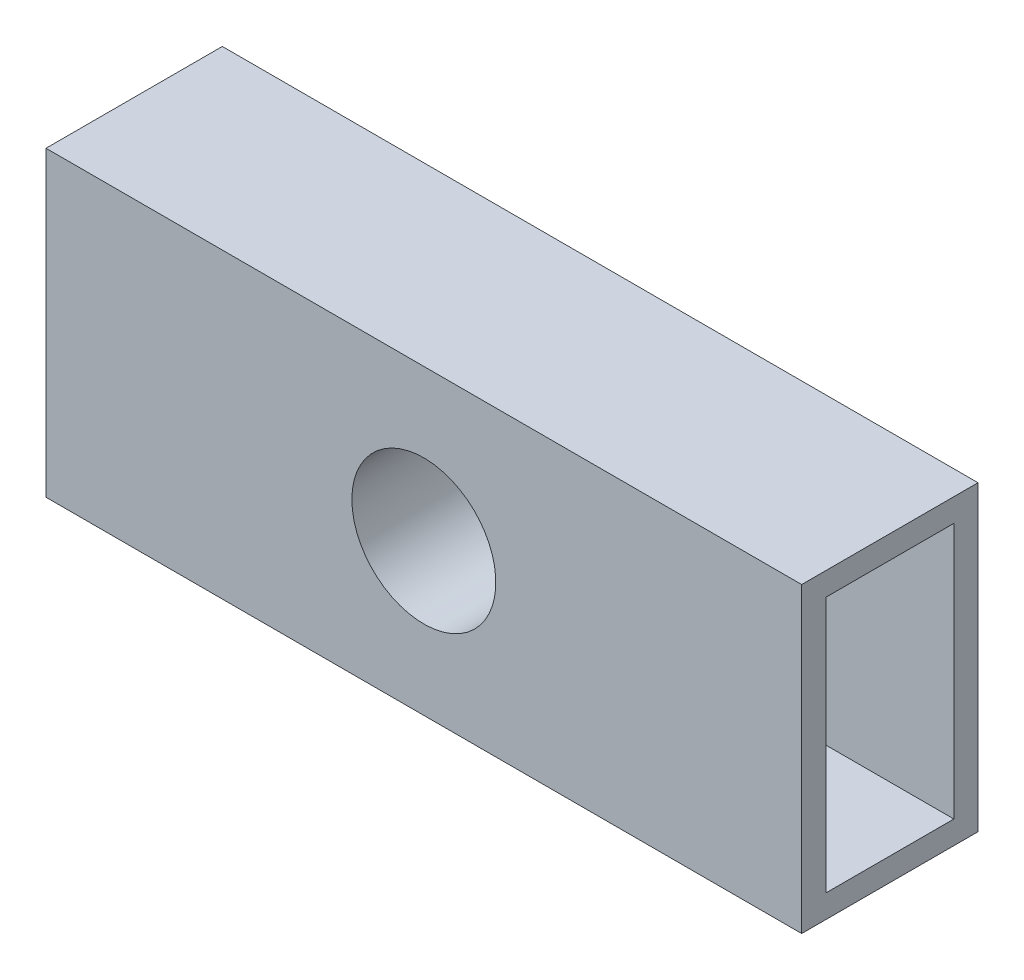
ISO-10303-21;
HEADER;
FILE_DESCRIPTION(('STEP AP214'),'2;1');
FILE_NAME('part.step','',(''),(''),'','','');
FILE_SCHEMA(('AUTOMOTIVE_DESIGN { 1 0 10303 214 1 1 1 1 }'));
ENDSEC;
DATA;
#1=APPLICATION_CONTEXT('core data for automotive mechanical design processes');
#2=APPLICATION_PROTOCOL_DEFINITION('international standard','automotive_design',2000,#1);
#3=PRODUCT_CONTEXT('',#1,'mechanical');
#4=PRODUCT('Part','Part','',(#3));
#5=PRODUCT_RELATED_PRODUCT_CATEGORY('part','',(#4));
#6=PRODUCT_DEFINITION_FORMATION('','',#4);
#7=PRODUCT_DEFINITION_CONTEXT('part definition',#1,'design');
#8=PRODUCT_DEFINITION('design','',#6,#7);
#9=PRODUCT_DEFINITION_SHAPE('','',#8);
#10=(LENGTH_UNIT() NAMED_UNIT(*) SI_UNIT(.MILLI.,.METRE.));
#11=(NAMED_UNIT(*) PLANE_ANGLE_UNIT() SI_UNIT($,.RADIAN.));
#12=(NAMED_UNIT(*) SI_UNIT($,.STERADIAN.) SOLID_ANGLE_UNIT());
#13=UNCERTAINTY_MEASURE_WITH_UNIT(LENGTH_MEASURE(1.E-05),#10,'distance_accuracy_value','');
#14=(GEOMETRIC_REPRESENTATION_CONTEXT(3) GLOBAL_UNCERTAINTY_ASSIGNED_CONTEXT((#13)) GLOBAL_UNIT_ASSIGNED_CONTEXT((#10,
#11,#12)) REPRESENTATION_CONTEXT('',''));
#15=CARTESIAN_POINT('',(0.,0.,0.));
#16=DIRECTION('',(0.,0.,1.));
#17=DIRECTION('',(1.,0.,0.));
#18=AXIS2_PLACEMENT_3D('',#15,#16,#17);
#19=CARTESIAN_POINT('',(-75.,-30.,17.5));
#20=DIRECTION('',(1.,0.,0.));
#21=DIRECTION('',(0.,0.,-1.));
#22=AXIS2_PLACEMENT_3D('',#19,#20,#21);
#23=PLANE('',#22);
#24=DIRECTION('',(0.,-1.,0.));
#25=VECTOR('',#24,1.);
#26=CARTESIAN_POINT('',(-75.,-30.,-17.5));
#27=LINE('',#26,#25);
#28=CARTESIAN_POINT('',(-75.,30.,-17.5));
#29=VERTEX_POINT('',#28);
#30=CARTESIAN_POINT('',(-75.,-30.,-17.5));
#31=VERTEX_POINT('',#30);
#32=EDGE_CURVE('E251',#29,#31,#27,.T.);
#33=ORIENTED_EDGE('',*,*,#32,.T.);
#34=DIRECTION('',(0.,0.,-1.));
#35=VECTOR('',#34,1.);
#36=CARTESIAN_POINT('',(-75.,-30.,17.5));
#37=LINE('',#36,#35);
#38=CARTESIAN_POINT('',(-75.,-30.,17.5));
#39=VERTEX_POINT('',#38);
#40=EDGE_CURVE('E259',#39,#31,#37,.T.);
#41=ORIENTED_EDGE('',*,*,#40,.F.);
#42=DIRECTION('',(0.,-1.,0.));
#43=VECTOR('',#42,1.);
#44=CARTESIAN_POINT('',(-75.,-30.,17.5));
#45=LINE('',#44,#43);
#46=CARTESIAN_POINT('',(-75.,30.,17.5));
#47=VERTEX_POINT('',#46);
#48=EDGE_CURVE('E238',#47,#39,#45,.T.);
#49=ORIENTED_EDGE('',*,*,#48,.F.);
#50=DIRECTION('',(0.,0.,-1.));
#51=VECTOR('',#50,1.);
#52=CARTESIAN_POINT('',(-75.,30.,17.5));
#53=LINE('',#52,#51);
#54=EDGE_CURVE('E48',#47,#29,#53,.T.);
#55=ORIENTED_EDGE('',*,*,#54,.T.);
#56=EDGE_LOOP('',(#33,#41,#49,#55));
#57=FACE_BOUND('',#56,.T.);
#58=DIRECTION('',(0.,1.,0.));
#59=VECTOR('',#58,1.);
#60=CARTESIAN_POINT('',(-75.,-25.415,-12.715));
#61=LINE('',#60,#59);
#62=CARTESIAN_POINT('',(-75.,-25.415,-12.715));
#63=VERTEX_POINT('',#62);
#64=CARTESIAN_POINT('',(-75.,25.415,-12.715));
#65=VERTEX_POINT('',#64);
#66=EDGE_CURVE('E55',#63,#65,#61,.T.);
#67=ORIENTED_EDGE('',*,*,#66,.T.);
#68=DIRECTION('',(0.,0.,1.));
#69=VECTOR('',#68,1.);
#70=CARTESIAN_POINT('',(-75.,25.415,12.715));
#71=LINE('',#70,#69);
#72=CARTESIAN_POINT('',(-75.,25.415,12.715));
#73=VERTEX_POINT('',#72);
#74=EDGE_CURVE('E152',#65,#73,#71,.T.);
#75=ORIENTED_EDGE('',*,*,#74,.T.);
#76=DIRECTION('',(0.,-1.,0.));
#77=VECTOR('',#76,1.);
#78=CARTESIAN_POINT('',(-75.,-25.415,12.715));
#79=LINE('',#78,#77);
#80=CARTESIAN_POINT('',(-75.,-25.415,12.715));
#81=VERTEX_POINT('',#80);
#82=EDGE_CURVE('E156',#73,#81,#79,.T.);
#83=ORIENTED_EDGE('',*,*,#82,.T.);
#84=DIRECTION('',(0.,0.,-1.));
#85=VECTOR('',#84,1.);
#86=CARTESIAN_POINT('',(-75.,-25.415,12.715));
#87=LINE('',#86,#85);
#88=EDGE_CURVE('E165',#81,#63,#87,.T.);
#89=ORIENTED_EDGE('',*,*,#88,.T.);
#90=EDGE_LOOP('',(#67,#75,#83,#89));
#91=FACE_BOUND('',#90,.T.);
#92=ADVANCED_FACE('F39',(#57,#91),#23,.F.);
#93=CARTESIAN_POINT('',(75.,-30.,17.5));
#94=DIRECTION('',(-1.,0.,0.));
#95=DIRECTION('',(0.,0.,1.));
#96=AXIS2_PLACEMENT_3D('',#93,#94,#95);
#97=PLANE('',#96);
#98=DIRECTION('',(0.,0.,1.));
#99=VECTOR('',#98,1.);
#100=CARTESIAN_POINT('',(75.,25.415,12.715));
#101=LINE('',#100,#99);
#102=CARTESIAN_POINT('',(75.,25.415,-12.715));
#103=VERTEX_POINT('',#102);
#104=CARTESIAN_POINT('',(75.,25.415,12.715));
#105=VERTEX_POINT('',#104);
#106=EDGE_CURVE('E207',#103,#105,#101,.T.);
#107=ORIENTED_EDGE('',*,*,#106,.F.);
#108=DIRECTION('',(0.,1.,0.));
#109=VECTOR('',#108,1.);
#110=CARTESIAN_POINT('',(75.,-25.415,-12.715));
#111=LINE('',#110,#109);
#112=CARTESIAN_POINT('',(75.,-25.415,-12.715));
#113=VERTEX_POINT('',#112);
#114=EDGE_CURVE('E63',#113,#103,#111,.T.);
#115=ORIENTED_EDGE('',*,*,#114,.F.);
#116=DIRECTION('',(0.,0.,-1.));
#117=VECTOR('',#116,1.);
#118=CARTESIAN_POINT('',(75.,-25.415,12.715));
#119=LINE('',#118,#117);
#120=CARTESIAN_POINT('',(75.,-25.415,12.715));
#121=VERTEX_POINT('',#120);
#122=EDGE_CURVE('E192',#121,#113,#119,.T.);
#123=ORIENTED_EDGE('',*,*,#122,.F.);
#124=DIRECTION('',(0.,-1.,0.));
#125=VECTOR('',#124,1.);
#126=CARTESIAN_POINT('',(75.,-25.415,12.715));
#127=LINE('',#126,#125);
#128=EDGE_CURVE('E211',#105,#121,#127,.T.);
#129=ORIENTED_EDGE('',*,*,#128,.F.);
#130=EDGE_LOOP('',(#107,#115,#123,#129));
#131=FACE_BOUND('',#130,.T.);
#132=DIRECTION('',(0.,1.,0.));
#133=VECTOR('',#132,1.);
#134=CARTESIAN_POINT('',(75.,-30.,-17.5));
#135=LINE('',#134,#133);
#136=CARTESIAN_POINT('',(75.,-30.,-17.5));
#137=VERTEX_POINT('',#136);
#138=CARTESIAN_POINT('',(75.,30.,-17.5));
#139=VERTEX_POINT('',#138);
#140=EDGE_CURVE('E221',#137,#139,#135,.T.);
#141=ORIENTED_EDGE('',*,*,#140,.T.);
#142=DIRECTION('',(0.,0.,-1.));
#143=VECTOR('',#142,1.);
#144=CARTESIAN_POINT('',(75.,30.,17.5));
#145=LINE('',#144,#143);
#146=CARTESIAN_POINT('',(75.,30.,17.5));
#147=VERTEX_POINT('',#146);
#148=EDGE_CURVE('E11',#147,#139,#145,.T.);
#149=ORIENTED_EDGE('',*,*,#148,.F.);
#150=DIRECTION('',(0.,1.,0.));
#151=VECTOR('',#150,1.);
#152=CARTESIAN_POINT('',(75.,-30.,17.5));
#153=LINE('',#152,#151);
#154=CARTESIAN_POINT('',(75.,-30.,17.5));
#155=VERTEX_POINT('',#154);
#156=EDGE_CURVE('E230',#155,#147,#153,.T.);
#157=ORIENTED_EDGE('',*,*,#156,.F.);
#158=DIRECTION('',(0.,0.,-1.));
#159=VECTOR('',#158,1.);
#160=CARTESIAN_POINT('',(75.,-30.,17.5));
#161=LINE('',#160,#159);
#162=EDGE_CURVE('E244',#155,#137,#161,.T.);
#163=ORIENTED_EDGE('',*,*,#162,.T.);
#164=EDGE_LOOP('',(#141,#149,#157,#163));
#165=FACE_BOUND('',#164,.T.);
#166=ADVANCED_FACE('F41',(#131,#165),#97,.F.);
#167=CARTESIAN_POINT('',(-75.,30.,17.5));
#168=DIRECTION('',(0.,-1.,0.));
#169=DIRECTION('',(0.,0.,-1.));
#170=AXIS2_PLACEMENT_3D('',#167,#168,#169);
#171=PLANE('',#170);
#172=DIRECTION('',(-1.,0.,0.));
#173=VECTOR('',#172,1.);
#174=CARTESIAN_POINT('',(-75.,30.,-17.5));
#175=LINE('',#174,#173);
#176=EDGE_CURVE('E248',#139,#29,#175,.T.);
#177=ORIENTED_EDGE('',*,*,#176,.T.);
#178=ORIENTED_EDGE('',*,*,#54,.F.);
#179=DIRECTION('',(-1.,0.,0.));
#180=VECTOR('',#179,1.);
#181=CARTESIAN_POINT('',(-75.,30.,17.5));
#182=LINE('',#181,#180);
#183=EDGE_CURVE('E234',#147,#47,#182,.T.);
#184=ORIENTED_EDGE('',*,*,#183,.F.);
#185=ORIENTED_EDGE('',*,*,#148,.T.);
#186=EDGE_LOOP('',(#177,#178,#184,#185));
#187=FACE_BOUND('',#186,.T.);
#188=ADVANCED_FACE('F284',(#187),#171,.F.);
#189=CARTESIAN_POINT('',(-75.,-30.,17.5));
#190=DIRECTION('',(0.,1.,0.));
#191=DIRECTION('',(0.,0.,1.));
#192=AXIS2_PLACEMENT_3D('',#189,#190,#191);
#193=PLANE('',#192);
#194=DIRECTION('',(1.,0.,0.));
#195=VECTOR('',#194,1.);
#196=CARTESIAN_POINT('',(-75.,-30.,-17.5));
#197=LINE('',#196,#195);
#198=EDGE_CURVE('E235',#31,#137,#197,.T.);
#199=ORIENTED_EDGE('',*,*,#198,.T.);
#200=ORIENTED_EDGE('',*,*,#162,.F.);
#201=DIRECTION('',(1.,0.,0.));
#202=VECTOR('',#201,1.);
#203=CARTESIAN_POINT('',(-75.,-30.,17.5));
#204=LINE('',#203,#202);
#205=EDGE_CURVE('E241',#39,#155,#204,.T.);
#206=ORIENTED_EDGE('',*,*,#205,.F.);
#207=ORIENTED_EDGE('',*,*,#40,.T.);
#208=EDGE_LOOP('',(#199,#200,#206,#207));
#209=FACE_BOUND('',#208,.T.);
#210=ADVANCED_FACE('F277',(#209),#193,.F.);
#211=CARTESIAN_POINT('',(0.,0.,17.5));
#212=DIRECTION('',(0.,0.,-1.));
#213=DIRECTION('',(-1.,0.,0.));
#214=AXIS2_PLACEMENT_3D('',#211,#212,#213);
#215=PLANE('',#214);
#216=CARTESIAN_POINT('',(0.,0.,17.5));
#217=DIRECTION('',(0.,0.,-1.));
#218=DIRECTION('',(-1.,0.,0.));
#219=AXIS2_PLACEMENT_3D('',#216,#217,#218);
#220=CIRCLE('',#219,14.2875);
#221=CARTESIAN_POINT('',(-14.2875,0.,17.5));
#222=VERTEX_POINT('',#221);
#223=EDGE_CURVE('E183',#222,#222,#220,.T.);
#224=ORIENTED_EDGE('',*,*,#223,.T.);
#225=EDGE_LOOP('',(#224));
#226=FACE_BOUND('',#225,.T.);
#227=ORIENTED_EDGE('',*,*,#156,.T.);
#228=ORIENTED_EDGE('',*,*,#183,.T.);
#229=ORIENTED_EDGE('',*,*,#48,.T.);
#230=ORIENTED_EDGE('',*,*,#205,.T.);
#231=EDGE_LOOP('',(#227,#228,#229,#230));
#232=FACE_BOUND('',#231,.T.);
#233=ADVANCED_FACE('F283',(#226,#232),#215,.F.);
#234=CARTESIAN_POINT('',(0.,0.,-17.5));
#235=DIRECTION('',(0.,0.,-1.));
#236=DIRECTION('',(-1.,0.,0.));
#237=AXIS2_PLACEMENT_3D('',#234,#235,#236);
#238=PLANE('',#237);
#239=CARTESIAN_POINT('',(0.,0.,-17.5));
#240=DIRECTION('',(0.,0.,-1.));
#241=DIRECTION('',(-1.,0.,0.));
#242=AXIS2_PLACEMENT_3D('',#239,#240,#241);
#243=CIRCLE('',#242,14.2875);
#244=CARTESIAN_POINT('',(-14.2875,0.,-17.5));
#245=VERTEX_POINT('',#244);
#246=EDGE_CURVE('E174',#245,#245,#243,.F.);
#247=ORIENTED_EDGE('',*,*,#246,.T.);
#248=EDGE_LOOP('',(#247));
#249=FACE_BOUND('',#248,.T.);
#250=ORIENTED_EDGE('',*,*,#140,.F.);
#251=ORIENTED_EDGE('',*,*,#198,.F.);
#252=ORIENTED_EDGE('',*,*,#32,.F.);
#253=ORIENTED_EDGE('',*,*,#176,.F.);
#254=EDGE_LOOP('',(#250,#251,#252,#253));
#255=FACE_BOUND('',#254,.T.);
#256=ADVANCED_FACE('F274',(#249,#255),#238,.T.);
#257=CARTESIAN_POINT('',(24.2,-25.415,-12.715));
#258=DIRECTION('',(0.,0.,-1.));
#259=DIRECTION('',(-1.,0.,0.));
#260=AXIS2_PLACEMENT_3D('',#257,#258,#259);
#261=PLANE('',#260);
#262=ORIENTED_EDGE('',*,*,#114,.T.);
#263=DIRECTION('',(1.,0.,0.));
#264=VECTOR('',#263,1.);
#265=CARTESIAN_POINT('',(24.2,25.415,-12.715));
#266=LINE('',#265,#264);
#267=CARTESIAN_POINT('',(24.2,25.415,-12.715));
#268=VERTEX_POINT('',#267);
#269=EDGE_CURVE('E204',#268,#103,#266,.T.);
#270=ORIENTED_EDGE('',*,*,#269,.F.);
#271=DIRECTION('',(0.,1.,0.));
#272=VECTOR('',#271,1.);
#273=CARTESIAN_POINT('',(24.2,-25.415,-12.715));
#274=LINE('',#273,#272);
#275=CARTESIAN_POINT('',(24.2,-25.415,-12.715));
#276=VERTEX_POINT('',#275);
#277=EDGE_CURVE('E187',#276,#268,#274,.T.);
#278=ORIENTED_EDGE('',*,*,#277,.F.);
#279=DIRECTION('',(1.,0.,0.));
#280=VECTOR('',#279,1.);
#281=CARTESIAN_POINT('',(24.2,-25.415,-12.715));
#282=LINE('',#281,#280);
#283=EDGE_CURVE('E218',#276,#113,#282,.T.);
#284=ORIENTED_EDGE('',*,*,#283,.T.);
#285=EDGE_LOOP('',(#262,#270,#278,#284));
#286=FACE_BOUND('',#285,.T.);
#287=ADVANCED_FACE('F299',(#286),#261,.F.);
#288=CARTESIAN_POINT('',(24.2,-25.415,12.715));
#289=DIRECTION('',(0.,-1.,0.));
#290=DIRECTION('',(0.,0.,-1.));
#291=AXIS2_PLACEMENT_3D('',#288,#289,#290);
#292=PLANE('',#291);
#293=ORIENTED_EDGE('',*,*,#122,.T.);
#294=ORIENTED_EDGE('',*,*,#283,.F.);
#295=DIRECTION('',(0.,0.,-1.));
#296=VECTOR('',#295,1.);
#297=CARTESIAN_POINT('',(24.2,-25.415,12.715));
#298=LINE('',#297,#296);
#299=CARTESIAN_POINT('',(24.2,-25.415,12.715));
#300=VERTEX_POINT('',#299);
#301=EDGE_CURVE('E200',#300,#276,#298,.T.);
#302=ORIENTED_EDGE('',*,*,#301,.F.);
#303=DIRECTION('',(1.,0.,0.));
#304=VECTOR('',#303,1.);
#305=CARTESIAN_POINT('',(24.2,-25.415,12.715));
#306=LINE('',#305,#304);
#307=EDGE_CURVE('E222',#300,#121,#306,.T.);
#308=ORIENTED_EDGE('',*,*,#307,.T.);
#309=EDGE_LOOP('',(#293,#294,#302,#308));
#310=FACE_BOUND('',#309,.T.);
#311=ADVANCED_FACE('F306',(#310),#292,.F.);
#312=CARTESIAN_POINT('',(24.2,-25.415,12.715));
#313=DIRECTION('',(0.,0.,1.));
#314=DIRECTION('',(1.,0.,0.));
#315=AXIS2_PLACEMENT_3D('',#312,#313,#314);
#316=PLANE('',#315);
#317=ORIENTED_EDGE('',*,*,#128,.T.);
#318=ORIENTED_EDGE('',*,*,#307,.F.);
#319=DIRECTION('',(0.,-1.,0.));
#320=VECTOR('',#319,1.);
#321=CARTESIAN_POINT('',(24.2,-25.415,12.715));
#322=LINE('',#321,#320);
#323=CARTESIAN_POINT('',(24.2,25.415,12.715));
#324=VERTEX_POINT('',#323);
#325=EDGE_CURVE('E196',#324,#300,#322,.T.);
#326=ORIENTED_EDGE('',*,*,#325,.F.);
#327=DIRECTION('',(1.,0.,0.));
#328=VECTOR('',#327,1.);
#329=CARTESIAN_POINT('',(24.2,25.415,12.715));
#330=LINE('',#329,#328);
#331=EDGE_CURVE('E225',#324,#105,#330,.T.);
#332=ORIENTED_EDGE('',*,*,#331,.T.);
#333=EDGE_LOOP('',(#317,#318,#326,#332));
#334=FACE_BOUND('',#333,.T.);
#335=ADVANCED_FACE('F311',(#334),#316,.F.);
#336=CARTESIAN_POINT('',(24.2,25.415,12.715));
#337=DIRECTION('',(0.,1.,0.));
#338=DIRECTION('',(0.,0.,1.));
#339=AXIS2_PLACEMENT_3D('',#336,#337,#338);
#340=PLANE('',#339);
#341=ORIENTED_EDGE('',*,*,#106,.T.);
#342=ORIENTED_EDGE('',*,*,#331,.F.);
#343=DIRECTION('',(0.,0.,1.));
#344=VECTOR('',#343,1.);
#345=CARTESIAN_POINT('',(24.2,25.415,12.715));
#346=LINE('',#345,#344);
#347=EDGE_CURVE('E191',#268,#324,#346,.T.);
#348=ORIENTED_EDGE('',*,*,#347,.F.);
#349=ORIENTED_EDGE('',*,*,#269,.T.);
#350=EDGE_LOOP('',(#341,#342,#348,#349));
#351=FACE_BOUND('',#350,.T.);
#352=ADVANCED_FACE('F307',(#351),#340,.F.);
#353=CARTESIAN_POINT('',(24.2,0.,0.));
#354=DIRECTION('',(-1.,0.,0.));
#355=DIRECTION('',(0.,0.,1.));
#356=AXIS2_PLACEMENT_3D('',#353,#354,#355);
#357=PLANE('',#356);
#358=ORIENTED_EDGE('',*,*,#277,.T.);
#359=ORIENTED_EDGE('',*,*,#347,.T.);
#360=ORIENTED_EDGE('',*,*,#325,.T.);
#361=ORIENTED_EDGE('',*,*,#301,.T.);
#362=EDGE_LOOP('',(#358,#359,#360,#361));
#363=FACE_BOUND('',#362,.T.);
#364=ADVANCED_FACE('F310',(#363),#357,.F.);
#365=CARTESIAN_POINT('',(0.,0.,57.9111525448112));
#366=DIRECTION('',(0.,0.,-1.));
#367=DIRECTION('',(-1.,0.,0.));
#368=AXIS2_PLACEMENT_3D('',#365,#366,#367);
#369=CYLINDRICAL_SURFACE('',#368,14.2875);
#370=ORIENTED_EDGE('',*,*,#223,.F.);
#371=EDGE_LOOP('',(#370));
#372=FACE_BOUND('',#371,.T.);
#373=ORIENTED_EDGE('',*,*,#246,.F.);
#374=EDGE_LOOP('',(#373));
#375=FACE_BOUND('',#374,.T.);
#376=ADVANCED_FACE('F321',(#372,#375),#369,.F.);
#377=CARTESIAN_POINT('',(-24.2,-25.415,-12.715));
#378=DIRECTION('',(0.,0.,1.));
#379=DIRECTION('',(1.,0.,0.));
#380=AXIS2_PLACEMENT_3D('',#377,#378,#379);
#381=PLANE('',#380);
#382=ORIENTED_EDGE('',*,*,#66,.F.);
#383=DIRECTION('',(-1.,0.,0.));
#384=VECTOR('',#383,1.);
#385=CARTESIAN_POINT('',(-24.2,-25.415,-12.715));
#386=LINE('',#385,#384);
#387=CARTESIAN_POINT('',(-24.2,-25.415,-12.715));
#388=VERTEX_POINT('',#387);
#389=EDGE_CURVE('E134',#388,#63,#386,.T.);
#390=ORIENTED_EDGE('',*,*,#389,.F.);
#391=DIRECTION('',(0.,1.,0.));
#392=VECTOR('',#391,1.);
#393=CARTESIAN_POINT('',(-24.2,-25.415,-12.715));
#394=LINE('',#393,#392);
#395=CARTESIAN_POINT('',(-24.2,25.415,-12.715));
#396=VERTEX_POINT('',#395);
#397=EDGE_CURVE('E142',#388,#396,#394,.T.);
#398=ORIENTED_EDGE('',*,*,#397,.T.);
#399=DIRECTION('',(-1.,0.,0.));
#400=VECTOR('',#399,1.);
#401=CARTESIAN_POINT('',(-24.2,25.415,-12.715));
#402=LINE('',#401,#400);
#403=EDGE_CURVE('E171',#396,#65,#402,.T.);
#404=ORIENTED_EDGE('',*,*,#403,.T.);
#405=EDGE_LOOP('',(#382,#390,#398,#404));
#406=FACE_BOUND('',#405,.T.);
#407=ADVANCED_FACE('F145',(#406),#381,.T.);
#408=CARTESIAN_POINT('',(-24.2,25.415,12.715));
#409=DIRECTION('',(0.,-1.,0.));
#410=DIRECTION('',(0.,0.,-1.));
#411=AXIS2_PLACEMENT_3D('',#408,#409,#410);
#412=PLANE('',#411);
#413=ORIENTED_EDGE('',*,*,#74,.F.);
#414=ORIENTED_EDGE('',*,*,#403,.F.);
#415=DIRECTION('',(0.,0.,1.));
#416=VECTOR('',#415,1.);
#417=CARTESIAN_POINT('',(-24.2,25.415,12.715));
#418=LINE('',#417,#416);
#419=CARTESIAN_POINT('',(-24.2,25.415,12.715));
#420=VERTEX_POINT('',#419);
#421=EDGE_CURVE('E148',#396,#420,#418,.T.);
#422=ORIENTED_EDGE('',*,*,#421,.T.);
#423=DIRECTION('',(-1.,0.,0.));
#424=VECTOR('',#423,1.);
#425=CARTESIAN_POINT('',(-24.2,25.415,12.715));
#426=LINE('',#425,#424);
#427=EDGE_CURVE('E175',#420,#73,#426,.T.);
#428=ORIENTED_EDGE('',*,*,#427,.T.);
#429=EDGE_LOOP('',(#413,#414,#422,#428));
#430=FACE_BOUND('',#429,.T.);
#431=ADVANCED_FACE('F328',(#430),#412,.T.);
#432=CARTESIAN_POINT('',(-24.2,-25.415,12.715));
#433=DIRECTION('',(0.,0.,-1.));
#434=DIRECTION('',(-1.,0.,0.));
#435=AXIS2_PLACEMENT_3D('',#432,#433,#434);
#436=PLANE('',#435);
#437=ORIENTED_EDGE('',*,*,#82,.F.);
#438=ORIENTED_EDGE('',*,*,#427,.F.);
#439=DIRECTION('',(0.,-1.,0.));
#440=VECTOR('',#439,1.);
#441=CARTESIAN_POINT('',(-24.2,-25.415,12.715));
#442=LINE('',#441,#440);
#443=CARTESIAN_POINT('',(-24.2,-25.415,12.715));
#444=VERTEX_POINT('',#443);
#445=EDGE_CURVE('E141',#420,#444,#442,.T.);
#446=ORIENTED_EDGE('',*,*,#445,.T.);
#447=DIRECTION('',(-1.,0.,0.));
#448=VECTOR('',#447,1.);
#449=CARTESIAN_POINT('',(-24.2,-25.415,12.715));
#450=LINE('',#449,#448);
#451=EDGE_CURVE('E136',#444,#81,#450,.T.);
#452=ORIENTED_EDGE('',*,*,#451,.T.);
#453=EDGE_LOOP('',(#437,#438,#446,#452));
#454=FACE_BOUND('',#453,.T.);
#455=ADVANCED_FACE('F331',(#454),#436,.T.);
#456=CARTESIAN_POINT('',(-24.2,-25.415,12.715));
#457=DIRECTION('',(0.,1.,0.));
#458=DIRECTION('',(0.,0.,1.));
#459=AXIS2_PLACEMENT_3D('',#456,#457,#458);
#460=PLANE('',#459);
#461=ORIENTED_EDGE('',*,*,#88,.F.);
#462=ORIENTED_EDGE('',*,*,#451,.F.);
#463=DIRECTION('',(0.,0.,-1.));
#464=VECTOR('',#463,1.);
#465=CARTESIAN_POINT('',(-24.2,-25.415,12.715));
#466=LINE('',#465,#464);
#467=EDGE_CURVE('E131',#444,#388,#466,.T.);
#468=ORIENTED_EDGE('',*,*,#467,.T.);
#469=ORIENTED_EDGE('',*,*,#389,.T.);
#470=EDGE_LOOP('',(#461,#462,#468,#469));
#471=FACE_BOUND('',#470,.T.);
#472=ADVANCED_FACE('F133',(#471),#460,.T.);
#473=CARTESIAN_POINT('',(-24.2,0.,0.));
#474=DIRECTION('',(1.,0.,0.));
#475=DIRECTION('',(0.,0.,1.));
#476=AXIS2_PLACEMENT_3D('',#473,#474,#475);
#477=PLANE('',#476);
#478=ORIENTED_EDGE('',*,*,#397,.F.);
#479=ORIENTED_EDGE('',*,*,#467,.F.);
#480=ORIENTED_EDGE('',*,*,#445,.F.);
#481=ORIENTED_EDGE('',*,*,#421,.F.);
#482=EDGE_LOOP('',(#478,#479,#480,#481));
#483=FACE_BOUND('',#482,.T.);
#484=ADVANCED_FACE('F150',(#483),#477,.F.);
#485=CLOSED_SHELL('',(#92,#166,#188,#210,#233,#256,#287,#311,#335,#352,#364,#376,#407,#431,#455,
#472,#484));
#486=MANIFOLD_SOLID_BREP('B2',#485);
#487=ADVANCED_BREP_SHAPE_REPRESENTATION('',(#18,#486),#14);
#488=SHAPE_DEFINITION_REPRESENTATION(#9,#487);
ENDSEC;
END-ISO-10303-21;
